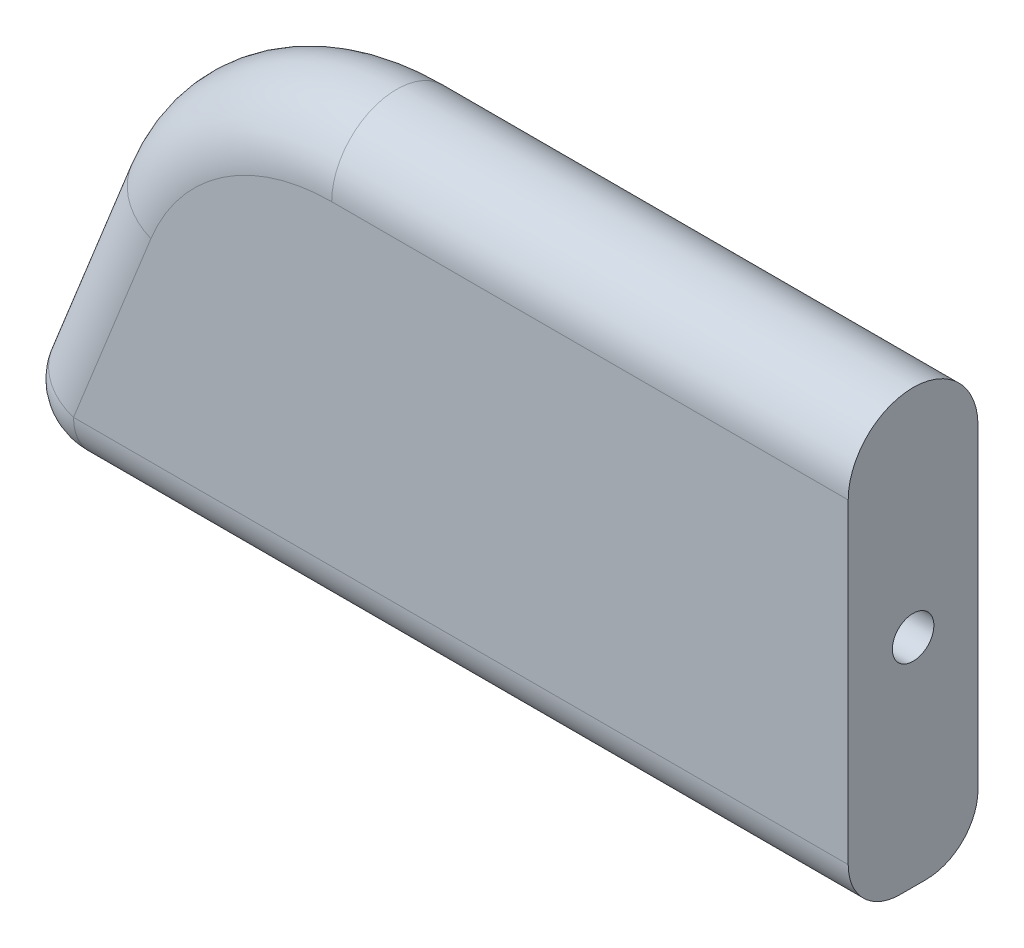
ISO-10303-21;
HEADER;
FILE_DESCRIPTION(('STEP AP214'),'2;1');
FILE_NAME('part.step','',(''),(''),'','','');
FILE_SCHEMA(('AUTOMOTIVE_DESIGN { 1 0 10303 214 1 1 1 1 }'));
ENDSEC;
DATA;
#1=APPLICATION_CONTEXT('core data for automotive mechanical design processes');
#2=APPLICATION_PROTOCOL_DEFINITION('international standard','automotive_design',2000,#1);
#3=PRODUCT_CONTEXT('',#1,'mechanical');
#4=PRODUCT('Part','Part','',(#3));
#5=PRODUCT_RELATED_PRODUCT_CATEGORY('part','',(#4));
#6=PRODUCT_DEFINITION_FORMATION('','',#4);
#7=PRODUCT_DEFINITION_CONTEXT('part definition',#1,'design');
#8=PRODUCT_DEFINITION('design','',#6,#7);
#9=PRODUCT_DEFINITION_SHAPE('','',#8);
#10=(LENGTH_UNIT() NAMED_UNIT(*) SI_UNIT(.MILLI.,.METRE.));
#11=(NAMED_UNIT(*) PLANE_ANGLE_UNIT() SI_UNIT($,.RADIAN.));
#12=(NAMED_UNIT(*) SI_UNIT($,.STERADIAN.) SOLID_ANGLE_UNIT());
#13=UNCERTAINTY_MEASURE_WITH_UNIT(LENGTH_MEASURE(1.E-05),#10,'distance_accuracy_value','');
#14=(GEOMETRIC_REPRESENTATION_CONTEXT(3) GLOBAL_UNCERTAINTY_ASSIGNED_CONTEXT((#13)) GLOBAL_UNIT_ASSIGNED_CONTEXT((#10,
#11,#12)) REPRESENTATION_CONTEXT('',''));
#15=CARTESIAN_POINT('',(0.,0.,0.));
#16=DIRECTION('',(0.,0.,1.));
#17=DIRECTION('',(1.,0.,0.));
#18=AXIS2_PLACEMENT_3D('',#15,#16,#17);
#19=CARTESIAN_POINT('',(-59.689011157193,-5.,0.));
#20=DIRECTION('',(0.,0.,1.));
#21=DIRECTION('',(1.,0.,0.));
#22=AXIS2_PLACEMENT_3D('',#19,#20,#21);
#23=TOROIDAL_SURFACE('',#22,22.5,7.5);
#24=CARTESIAN_POINT('',(-80.5797367021113,3.35629021796731,0.));
#25=DIRECTION('',(-0.371390676354103,-0.928476690885259,0.));
#26=DIRECTION('',(0.,0.,1.));
#27=AXIS2_PLACEMENT_3D('',#24,#25,#26);
#28=CIRCLE('',#27,7.5);
#29=CARTESIAN_POINT('',(-80.5797367021113,3.35629021796731,7.5));
#30=VERTEX_POINT('',#29);
#31=CARTESIAN_POINT('',(-80.5797367021113,3.35629021796731,-7.5));
#32=VERTEX_POINT('',#31);
#33=EDGE_CURVE('E173',#30,#32,#28,.T.);
#34=ORIENTED_EDGE('',*,*,#33,.F.);
#35=CARTESIAN_POINT('',(-59.689011157193,-5.,7.5));
#36=DIRECTION('',(0.,0.,-1.));
#37=DIRECTION('',(-1.,0.,0.));
#38=AXIS2_PLACEMENT_3D('',#35,#36,#37);
#39=CIRCLE('',#38,22.5);
#40=CARTESIAN_POINT('',(-59.689011157193,17.5,7.5));
#41=VERTEX_POINT('',#40);
#42=EDGE_CURVE('E126',#41,#30,#39,.F.);
#43=ORIENTED_EDGE('',*,*,#42,.F.);
#44=CARTESIAN_POINT('',(-59.689011157193,17.5,7.5));
#45=CARTESIAN_POINT('',(-59.689011157193,17.6227185869567,7.50000260316581));
#46=CARTESIAN_POINT('',(-59.689011157193,17.7454369524094,7.49698812843865));
#47=CARTESIAN_POINT('',(-59.689011157193,17.9905781625018,7.48494371463894));
#48=CARTESIAN_POINT('',(-59.689011157193,18.1130010071414,7.4759137755664));
#49=CARTESIAN_POINT('',(-59.689011157193,18.357256097802,7.45185712451655));
#50=CARTESIAN_POINT('',(-59.689011157193,18.479088343823,7.43683041253923));
#51=CARTESIAN_POINT('',(-59.689011157193,18.7218687730074,7.40081723693248));
#52=CARTESIAN_POINT('',(-59.689011157193,18.8428169561708,7.37983077330304));
#53=CARTESIAN_POINT('',(-59.689011157193,19.0835378740711,7.33194843274541));
#54=CARTESIAN_POINT('',(-59.689011157193,19.203310608808,7.30505255581723));
#55=CARTESIAN_POINT('',(-59.689011157193,19.4413920897409,7.24541624210093));
#56=CARTESIAN_POINT('',(-59.689011157193,19.5597008359369,7.21267580531283));
#57=CARTESIAN_POINT('',(-59.689011157193,19.7945693228801,7.1414292306703));
#58=CARTESIAN_POINT('',(-59.689011157193,19.9111290636273,7.10292309281587));
#59=CARTESIAN_POINT('',(-59.689011157193,20.142218737256,7.02023788492944));
#60=CARTESIAN_POINT('',(-59.689011157193,20.2567486701374,6.97605881489746));
#61=CARTESIAN_POINT('',(-59.689011157193,20.4835028153389,6.88213417277185));
#62=CARTESIAN_POINT('',(-59.689011157193,20.5957270276589,6.83238860067823));
#63=CARTESIAN_POINT('',(-59.689011157193,20.8175993737953,6.72745079617342));
#64=CARTESIAN_POINT('',(-59.689011157193,20.9272475076117,6.67225856376224));
#65=CARTESIAN_POINT('',(-59.689011157193,21.1437035447783,6.55656040146308));
#66=CARTESIAN_POINT('',(-59.689011157193,21.2505114481286,6.49605447157511));
#67=CARTESIAN_POINT('',(-59.689011157193,21.4610297147697,6.36987467842897));
#68=CARTESIAN_POINT('',(-59.689011157193,21.5647400780606,6.3042008151708));
#69=CARTESIAN_POINT('',(-59.689011157193,21.7688134172334,6.16784336936737));
#70=CARTESIAN_POINT('',(-59.689011157193,21.8691763931154,6.09715978682211));
#71=CARTESIAN_POINT('',(-59.689011157193,22.066313174271,5.95095318538756));
#72=CARTESIAN_POINT('',(-59.689011157193,22.1630869795446,5.87543016649827));
#73=CARTESIAN_POINT('',(-59.689011157193,22.3528122829101,5.71972663394278));
#74=CARTESIAN_POINT('',(-59.689011157193,22.4457637810019,5.63954612027658));
#75=CARTESIAN_POINT('',(-59.689011157193,22.6276205417034,5.4747207600478));
#76=CARTESIAN_POINT('',(-59.689011157193,22.716525804313,5.39007591348521));
#77=CARTESIAN_POINT('',(-59.689011157193,22.8900759134852,5.216525804313));
#78=CARTESIAN_POINT('',(-59.689011157193,22.9747207600478,5.12762054170337));
#79=CARTESIAN_POINT('',(-59.689011157193,23.1395461202766,4.9457637810019));
#80=CARTESIAN_POINT('',(-59.689011157193,23.2197266339428,4.85281228291005));
#81=CARTESIAN_POINT('',(-59.689011157193,23.3754301664983,4.66308697954463));
#82=CARTESIAN_POINT('',(-59.689011157193,23.4509531853877,4.56631317427105));
#83=CARTESIAN_POINT('',(-59.689011157193,23.597159786822,4.36917639311545));
#84=CARTESIAN_POINT('',(-59.689011157193,23.667843369367,4.26881341723343));
#85=CARTESIAN_POINT('',(-59.689011157193,23.8042008151712,4.0647400780606));
#86=CARTESIAN_POINT('',(-59.689011157193,23.8698746784303,3.9610297147698));
#87=CARTESIAN_POINT('',(-59.689011157193,23.9960544715738,3.75051144812853));
#88=CARTESIAN_POINT('',(-59.689011157193,24.0565604014581,3.64370354477806));
#89=CARTESIAN_POINT('',(-59.689011157193,24.1722585637672,3.4272475076119));
#90=CARTESIAN_POINT('',(-59.689011157193,24.227450796192,3.31759937379621));
#91=CARTESIAN_POINT('',(-59.689011157193,24.3323886006597,3.09572702765802));
#92=CARTESIAN_POINT('',(-59.689011157193,24.3821341727027,2.98350281533551));
#93=CARTESIAN_POINT('',(-59.689011157193,24.4760588149666,2.75674867014084));
#94=CARTESIAN_POINT('',(-59.689011157193,24.5202378851876,2.64221873726868));
#95=CARTESIAN_POINT('',(-59.689011157193,24.6029230925577,2.41112906361462));
#96=CARTESIAN_POINT('',(-59.689011157193,24.6414292297069,2.29456932283273));
#97=CARTESIAN_POINT('',(-59.689011157193,24.7126758062763,2.0597008359842));
#98=CARTESIAN_POINT('',(-59.689011157193,24.7454162456965,1.94139208991755));
#99=CARTESIAN_POINT('',(-59.689011157193,24.8050525522217,1.7033106086314));
#100=CARTESIAN_POINT('',(-59.689011157193,24.8319484193267,1.5835378734119));
#101=CARTESIAN_POINT('',(-59.689011157193,24.8798307867218,1.34281695683002));
#102=CARTESIAN_POINT('',(-59.689011157193,24.9008172870119,1.22186877546766));
#103=CARTESIAN_POINT('',(-59.689011157193,24.9368303624598,0.979088341362769));
#104=CARTESIAN_POINT('',(-59.689011157193,24.9518569376176,0.85725608862025));
#105=CARTESIAN_POINT('',(-59.689011157193,24.9759139624653,0.61300101632316));
#106=CARTESIAN_POINT('',(-59.689011157193,24.9849444121551,0.490578196768591));
#107=CARTESIAN_POINT('',(-59.689011157193,24.9969874309225,0.24543691814268));
#108=CARTESIAN_POINT('',(-59.689011157193,25.,0.12271845907134));
#109=CARTESIAN_POINT('',(-59.689011157193,25.,-0.12271845907134));
#110=CARTESIAN_POINT('',(-59.689011157193,24.9969874309225,-0.245436918142681));
#111=CARTESIAN_POINT('',(-59.689011157193,24.9849444121551,-0.490578196768591));
#112=CARTESIAN_POINT('',(-59.689011157193,24.9759139624653,-0.61300101632316));
#113=CARTESIAN_POINT('',(-59.689011157193,24.9518569376176,-0.85725608862025));
#114=CARTESIAN_POINT('',(-59.689011157193,24.9368303624598,-0.979088341362769));
#115=CARTESIAN_POINT('',(-59.689011157193,24.9008172870119,-1.22186877546766));
#116=CARTESIAN_POINT('',(-59.689011157193,24.8798307867218,-1.34281695683002));
#117=CARTESIAN_POINT('',(-59.689011157193,24.8319484193267,-1.5835378734119));
#118=CARTESIAN_POINT('',(-59.689011157193,24.8050525522217,-1.7033106086314));
#119=CARTESIAN_POINT('',(-59.689011157193,24.7454162456965,-1.94139208991755));
#120=CARTESIAN_POINT('',(-59.689011157193,24.7126758062763,-2.0597008359842));
#121=CARTESIAN_POINT('',(-59.689011157193,24.6414292297069,-2.29456932283273));
#122=CARTESIAN_POINT('',(-59.689011157193,24.6029230925577,-2.41112906361462));
#123=CARTESIAN_POINT('',(-59.689011157193,24.5202378851876,-2.64221873726868));
#124=CARTESIAN_POINT('',(-59.689011157193,24.4760588149666,-2.75674867014084));
#125=CARTESIAN_POINT('',(-59.689011157193,24.3821341727027,-2.98350281533551));
#126=CARTESIAN_POINT('',(-59.689011157193,24.3323886006597,-3.09572702765802));
#127=CARTESIAN_POINT('',(-59.689011157193,24.227450796192,-3.31759937379621));
#128=CARTESIAN_POINT('',(-59.689011157193,24.1722585637672,-3.4272475076119));
#129=CARTESIAN_POINT('',(-59.689011157193,24.0565604014581,-3.64370354477806));
#130=CARTESIAN_POINT('',(-59.689011157193,23.9960544715738,-3.75051144812853));
#131=CARTESIAN_POINT('',(-59.689011157193,23.8698746784303,-3.9610297147698));
#132=CARTESIAN_POINT('',(-59.689011157193,23.8042008151712,-4.0647400780606));
#133=CARTESIAN_POINT('',(-59.689011157193,23.667843369367,-4.26881341723343));
#134=CARTESIAN_POINT('',(-59.689011157193,23.597159786822,-4.36917639311545));
#135=CARTESIAN_POINT('',(-59.689011157193,23.4509531853877,-4.56631317427105));
#136=CARTESIAN_POINT('',(-59.689011157193,23.3754301664983,-4.66308697954463));
#137=CARTESIAN_POINT('',(-59.689011157193,23.2197266339428,-4.85281228291005));
#138=CARTESIAN_POINT('',(-59.689011157193,23.1395461202766,-4.9457637810019));
#139=CARTESIAN_POINT('',(-59.689011157193,22.9747207600478,-5.12762054170337));
#140=CARTESIAN_POINT('',(-59.689011157193,22.8900759134852,-5.216525804313));
#141=CARTESIAN_POINT('',(-59.689011157193,22.716525804313,-5.39007591348521));
#142=CARTESIAN_POINT('',(-59.689011157193,22.6276205417034,-5.4747207600478));
#143=CARTESIAN_POINT('',(-59.689011157193,22.4457637810019,-5.63954612027658));
#144=CARTESIAN_POINT('',(-59.689011157193,22.3528122829101,-5.71972663394278));
#145=CARTESIAN_POINT('',(-59.689011157193,22.1630869795446,-5.87543016649827));
#146=CARTESIAN_POINT('',(-59.689011157193,22.066313174271,-5.95095318538756));
#147=CARTESIAN_POINT('',(-59.689011157193,21.8691763931154,-6.09715978682211));
#148=CARTESIAN_POINT('',(-59.689011157193,21.7688134172334,-6.16784336936737));
#149=CARTESIAN_POINT('',(-59.689011157193,21.5647400780606,-6.3042008151708));
#150=CARTESIAN_POINT('',(-59.689011157193,21.4610297147697,-6.36987467842897));
#151=CARTESIAN_POINT('',(-59.689011157193,21.2505114481286,-6.49605447157511));
#152=CARTESIAN_POINT('',(-59.689011157193,21.1437035447783,-6.55656040146308));
#153=CARTESIAN_POINT('',(-59.689011157193,20.9272475076117,-6.67225856376224));
#154=CARTESIAN_POINT('',(-59.689011157193,20.8175993737953,-6.72745079617342));
#155=CARTESIAN_POINT('',(-59.689011157193,20.5957270276589,-6.83238860067823));
#156=CARTESIAN_POINT('',(-59.689011157193,20.4835028153389,-6.88213417277185));
#157=CARTESIAN_POINT('',(-59.689011157193,20.2567486701374,-6.97605881489745));
#158=CARTESIAN_POINT('',(-59.689011157193,20.142218737256,-7.02023788492944));
#159=CARTESIAN_POINT('',(-59.689011157193,19.9111290636273,-7.10292309281587));
#160=CARTESIAN_POINT('',(-59.689011157193,19.7945693228801,-7.1414292306703));
#161=CARTESIAN_POINT('',(-59.689011157193,19.5597008359369,-7.21267580531283));
#162=CARTESIAN_POINT('',(-59.689011157193,19.4413920897409,-7.24541624210093));
#163=CARTESIAN_POINT('',(-59.689011157193,19.203310608808,-7.30505255581723));
#164=CARTESIAN_POINT('',(-59.689011157193,19.0835378740711,-7.33194843274541));
#165=CARTESIAN_POINT('',(-59.689011157193,18.8428169561708,-7.37983077330304));
#166=CARTESIAN_POINT('',(-59.689011157193,18.7218687730074,-7.40081723693248));
#167=CARTESIAN_POINT('',(-59.689011157193,18.479088343823,-7.43683041253923));
#168=CARTESIAN_POINT('',(-59.689011157193,18.357256097802,-7.45185712451655));
#169=CARTESIAN_POINT('',(-59.689011157193,18.1130010071414,-7.4759137755664));
#170=CARTESIAN_POINT('',(-59.689011157193,17.9905781625018,-7.48494371463894));
#171=CARTESIAN_POINT('',(-59.689011157193,17.7454369524094,-7.49698812843865));
#172=CARTESIAN_POINT('',(-59.689011157193,17.6227185869567,-7.50000260316581));
#173=CARTESIAN_POINT('',(-59.689011157193,17.5,-7.5));
#174=B_SPLINE_CURVE_WITH_KNOTS('',3,(#44,#45,#46,#47,#48,#49,#50,#51,#52,#53,#54,#55,#56,#57,
#58,#59,#60,#61,#62,#63,#64,#65,#66,#67,#68,#69,#70,#71,#72,#73,#74,#75,#76,#77,#78,#79,#80,#81,
#82,#83,#84,#85,#86,#87,#88,#89,#90,#91,#92,#93,#94,#95,#96,#97,#98,#99,#100,#101,#102,#103,
#104,#105,#106,#107,#108,#109,#110,#111,#112,#113,#114,#115,#116,#117,#118,#119,#120,#121,#122,
#123,#124,#125,#126,#127,#128,#129,#130,#131,#132,#133,#134,#135,#136,#137,#138,#139,#140,#141,
#142,#143,#144,#145,#146,#147,#148,#149,#150,#151,#152,#153,#154,#155,#156,#157,#158,#159,#160,
#161,#162,#163,#164,#165,#166,#167,#168,#169,#170,#171,#172,#173),.UNSPECIFIED.,.F.,.F.,(4,2,2,
2,2,2,2,2,2,2,2,2,2,2,2,2,2,2,2,2,2,2,2,2,2,2,2,2,2,2,2,2,2,2,2,2,2,2,2,2,2,2,2,2,2,2,2,2,2,2,2,
2,2,2,2,2,2,2,2,2,2,2,2,2,4),(0.,0.368118427843683,0.736236855687369,1.10435528353105,
1.47247371137474,1.84059213921842,2.2087105670621,2.57682899490579,2.94494742274947,
3.31306585059316,3.68118427843684,4.04930270628052,4.41742113412421,4.7855395619679,
5.15365798981158,5.52177641765527,5.88989484549895,6.25801327334263,6.62613170118632,
6.99425012903,7.36236855687369,7.73048698471737,8.09860541256105,8.46672384040474,
8.83484226824842,9.20296069609211,9.57107912393579,9.93919755177948,10.3073159796232,
10.6754344074668,11.0435528353105,11.4116712631542,11.7797896909979,12.1479081188416,
12.5160265466853,12.884144974529,13.2522634023726,13.6203818302163,13.98850025806,
14.3566186859037,14.7247371137474,15.0928555415911,15.4609739694347,15.8290923972784,
16.1972108251221,16.5653292529658,16.9334476808095,17.3015661086532,17.6696845364968,
18.0378029643405,18.4059213921842,18.7740398200279,19.1421582478716,19.5102766757153,
19.878395103559,20.2465135314026,20.6146319592463,20.98275038709,21.3508688149337,
21.7189872427774,22.0871056706211,22.4552240984647,22.8233425263084,23.1914609541521,
23.5595793819958),.UNSPECIFIED.);
#175=CARTESIAN_POINT('',(-59.689011157193,17.5,-7.5));
#176=VERTEX_POINT('',#175);
#177=EDGE_CURVE('E120',#41,#176,#174,.T.);
#178=ORIENTED_EDGE('',*,*,#177,.T.);
#179=CARTESIAN_POINT('',(-59.689011157193,-5.,-7.5));
#180=DIRECTION('',(0.,0.,-1.));
#181=DIRECTION('',(-1.,0.,0.));
#182=AXIS2_PLACEMENT_3D('',#179,#180,#181);
#183=CIRCLE('',#182,22.5);
#184=EDGE_CURVE('E128',#32,#176,#183,.T.);
#185=ORIENTED_EDGE('',*,*,#184,.F.);
#186=EDGE_LOOP('',(#34,#43,#178,#185));
#187=FACE_BOUND('',#186,.T.);
#188=ADVANCED_FACE('F39',(#187),#23,.T.);
#189=CARTESIAN_POINT('',(0.,17.5,0.));
#190=DIRECTION('',(-1.,0.,0.));
#191=DIRECTION('',(0.,-1.,0.));
#192=AXIS2_PLACEMENT_3D('',#189,#190,#191);
#193=CYLINDRICAL_SURFACE('',#192,7.5);
#194=ORIENTED_EDGE('',*,*,#177,.F.);
#195=DIRECTION('',(-1.,0.,0.));
#196=VECTOR('',#195,1.);
#197=CARTESIAN_POINT('',(-59.689011157193,17.5,7.5));
#198=LINE('',#197,#196);
#199=CARTESIAN_POINT('',(0.,17.5,7.5));
#200=VERTEX_POINT('',#199);
#201=EDGE_CURVE('E105',#200,#41,#198,.T.);
#202=ORIENTED_EDGE('',*,*,#201,.F.);
#203=CARTESIAN_POINT('',(0.,17.5,0.));
#204=DIRECTION('',(-1.,0.,0.));
#205=DIRECTION('',(0.,-1.,0.));
#206=AXIS2_PLACEMENT_3D('',#203,#204,#205);
#207=CIRCLE('',#206,7.5);
#208=CARTESIAN_POINT('',(0.,17.5,-7.5));
#209=VERTEX_POINT('',#208);
#210=EDGE_CURVE('E114',#209,#200,#207,.F.);
#211=ORIENTED_EDGE('',*,*,#210,.F.);
#212=DIRECTION('',(1.,0.,0.));
#213=VECTOR('',#212,1.);
#214=CARTESIAN_POINT('',(0.,17.5,-7.5));
#215=LINE('',#214,#213);
#216=EDGE_CURVE('E121',#176,#209,#215,.T.);
#217=ORIENTED_EDGE('',*,*,#216,.F.);
#218=EDGE_LOOP('',(#194,#202,#211,#217));
#219=FACE_BOUND('',#218,.T.);
#220=ADVANCED_FACE('F123',(#219),#193,.T.);
#221=CARTESIAN_POINT('',(-80.5797367021113,3.35629021796731,0.));
#222=DIRECTION('',(-0.371390676354103,-0.928476690885259,0.));
#223=DIRECTION('',(0.928476690885259,-0.371390676354103,0.));
#224=AXIS2_PLACEMENT_3D('',#221,#222,#223);
#225=CYLINDRICAL_SURFACE('',#224,7.5);
#226=DIRECTION('',(0.371390676354103,0.928476690885259,0.));
#227=VECTOR('',#226,1.);
#228=CARTESIAN_POINT('',(-80.5797367021113,3.35629021796731,-7.5));
#229=LINE('',#228,#227);
#230=CARTESIAN_POINT('',(-89.5222527892982,-19.,-7.5));
#231=VERTEX_POINT('',#230);
#232=EDGE_CURVE('E125',#231,#32,#229,.T.);
#233=ORIENTED_EDGE('',*,*,#232,.F.);
#234=CARTESIAN_POINT('',(-89.5222527892982,-19.,0.));
#235=DIRECTION('',(-0.296166320396508,-0.955136383278741,0.));
#236=DIRECTION('',(-0.955136383278741,0.296166320396508,0.));
#237=AXIS2_PLACEMENT_3D('',#234,#235,#236);
#238=ELLIPSE('',#237,7.52396172239067,7.5);
#239=CARTESIAN_POINT('',(-89.5222527892982,-19.,7.5));
#240=VERTEX_POINT('',#239);
#241=EDGE_CURVE('E48',#231,#240,#238,.F.);
#242=ORIENTED_EDGE('',*,*,#241,.T.);
#243=DIRECTION('',(-0.371390676354103,-0.928476690885259,0.));
#244=VECTOR('',#243,1.);
#245=CARTESIAN_POINT('',(-80.5797367021113,3.35629021796733,7.5));
#246=LINE('',#245,#244);
#247=EDGE_CURVE('E130',#30,#240,#246,.T.);
#248=ORIENTED_EDGE('',*,*,#247,.F.);
#249=ORIENTED_EDGE('',*,*,#33,.T.);
#250=EDGE_LOOP('',(#233,#242,#248,#249));
#251=FACE_BOUND('',#250,.T.);
#252=ADVANCED_FACE('F196',(#251),#225,.T.);
#253=CARTESIAN_POINT('',(0.,-25.,7.5));
#254=DIRECTION('',(0.,1.,0.));
#255=DIRECTION('',(-1.,0.,0.));
#256=AXIS2_PLACEMENT_3D('',#253,#254,#255);
#257=PLANE('',#256);
#258=CARTESIAN_POINT('',(-89.5222527892982,-25.,0.));
#259=DIRECTION('',(0.,1.,0.));
#260=DIRECTION('',(-1.,0.,0.));
#261=AXIS2_PLACEMENT_3D('',#258,#259,#260);
#262=ELLIPSE('',#261,1.61554944214035,1.5);
#263=CARTESIAN_POINT('',(-89.5222527892982,-25.,1.5));
#264=VERTEX_POINT('',#263);
#265=CARTESIAN_POINT('',(-89.5222527892982,-25.,-1.5));
#266=VERTEX_POINT('',#265);
#267=EDGE_CURVE('E168',#264,#266,#262,.F.);
#268=ORIENTED_EDGE('',*,*,#267,.T.);
#269=DIRECTION('',(1.,0.,0.));
#270=VECTOR('',#269,1.);
#271=CARTESIAN_POINT('',(0.,-25.,-1.5));
#272=LINE('',#271,#270);
#273=CARTESIAN_POINT('',(0.,-25.,-1.5));
#274=VERTEX_POINT('',#273);
#275=EDGE_CURVE('E166',#266,#274,#272,.T.);
#276=ORIENTED_EDGE('',*,*,#275,.T.);
#277=DIRECTION('',(0.,0.,-1.));
#278=VECTOR('',#277,1.);
#279=CARTESIAN_POINT('',(0.,-25.,7.5));
#280=LINE('',#279,#278);
#281=CARTESIAN_POINT('',(0.,-25.,1.5));
#282=VERTEX_POINT('',#281);
#283=EDGE_CURVE('E110',#282,#274,#280,.T.);
#284=ORIENTED_EDGE('',*,*,#283,.F.);
#285=DIRECTION('',(1.,0.,0.));
#286=VECTOR('',#285,1.);
#287=CARTESIAN_POINT('',(0.,-25.,1.5));
#288=LINE('',#287,#286);
#289=EDGE_CURVE('E164',#282,#264,#288,.F.);
#290=ORIENTED_EDGE('',*,*,#289,.T.);
#291=EDGE_LOOP('',(#268,#276,#284,#290));
#292=FACE_BOUND('',#291,.T.);
#293=ADVANCED_FACE('F238',(#292),#257,.F.);
#294=CARTESIAN_POINT('',(0.,25.,7.5));
#295=DIRECTION('',(-1.,0.,0.));
#296=DIRECTION('',(0.,-1.,0.));
#297=AXIS2_PLACEMENT_3D('',#294,#295,#296);
#298=PLANE('',#297);
#299=CARTESIAN_POINT('',(0.,0.,0.));
#300=DIRECTION('',(1.,0.,0.));
#301=DIRECTION('',(0.,1.,0.));
#302=AXIS2_PLACEMENT_3D('',#299,#300,#301);
#303=CIRCLE('',#302,2.4);
#304=CARTESIAN_POINT('',(0.,2.4,0.));
#305=VERTEX_POINT('',#304);
#306=EDGE_CURVE('E340',#305,#305,#303,.T.);
#307=ORIENTED_EDGE('',*,*,#306,.F.);
#308=EDGE_LOOP('',(#307));
#309=FACE_BOUND('',#308,.T.);
#310=ORIENTED_EDGE('',*,*,#283,.T.);
#311=CARTESIAN_POINT('',(0.,-19.,-1.5));
#312=DIRECTION('',(-1.,0.,0.));
#313=DIRECTION('',(0.,-1.,0.));
#314=AXIS2_PLACEMENT_3D('',#311,#312,#313);
#315=CIRCLE('',#314,6.);
#316=CARTESIAN_POINT('',(0.,-19.,-7.5));
#317=VERTEX_POINT('',#316);
#318=EDGE_CURVE('E142',#274,#317,#315,.F.);
#319=ORIENTED_EDGE('',*,*,#318,.T.);
#320=DIRECTION('',(0.,1.,0.));
#321=VECTOR('',#320,1.);
#322=CARTESIAN_POINT('',(0.,25.,-7.5));
#323=LINE('',#322,#321);
#324=EDGE_CURVE('E111',#317,#209,#323,.T.);
#325=ORIENTED_EDGE('',*,*,#324,.T.);
#326=ORIENTED_EDGE('',*,*,#210,.T.);
#327=DIRECTION('',(0.,1.,0.));
#328=VECTOR('',#327,1.);
#329=CARTESIAN_POINT('',(0.,25.,7.5));
#330=LINE('',#329,#328);
#331=CARTESIAN_POINT('',(0.,-19.,7.5));
#332=VERTEX_POINT('',#331);
#333=EDGE_CURVE('E100',#332,#200,#330,.T.);
#334=ORIENTED_EDGE('',*,*,#333,.F.);
#335=CARTESIAN_POINT('',(0.,-19.,1.5));
#336=DIRECTION('',(-1.,0.,0.));
#337=DIRECTION('',(0.,-1.,0.));
#338=AXIS2_PLACEMENT_3D('',#335,#336,#337);
#339=CIRCLE('',#338,6.);
#340=EDGE_CURVE('E163',#332,#282,#339,.F.);
#341=ORIENTED_EDGE('',*,*,#340,.T.);
#342=EDGE_LOOP('',(#310,#319,#325,#326,#334,#341));
#343=FACE_BOUND('',#342,.T.);
#344=ADVANCED_FACE('F116',(#309,#343),#298,.F.);
#345=CARTESIAN_POINT('',(-59.689011157193,-5.,7.5));
#346=DIRECTION('',(0.,0.,-1.));
#347=DIRECTION('',(-1.,0.,0.));
#348=AXIS2_PLACEMENT_3D('',#345,#346,#347);
#349=PLANE('',#348);
#350=ORIENTED_EDGE('',*,*,#247,.T.);
#351=DIRECTION('',(1.,0.,0.));
#352=VECTOR('',#351,1.);
#353=CARTESIAN_POINT('',(-59.689011157193,-19.,7.5));
#354=LINE('',#353,#352);
#355=EDGE_CURVE('E11',#240,#332,#354,.T.);
#356=ORIENTED_EDGE('',*,*,#355,.T.);
#357=ORIENTED_EDGE('',*,*,#333,.T.);
#358=ORIENTED_EDGE('',*,*,#201,.T.);
#359=ORIENTED_EDGE('',*,*,#42,.T.);
#360=EDGE_LOOP('',(#350,#356,#357,#358,#359));
#361=FACE_BOUND('',#360,.T.);
#362=ADVANCED_FACE('F102',(#361),#349,.F.);
#363=CARTESIAN_POINT('',(-59.689011157193,-5.,-7.5));
#364=DIRECTION('',(0.,0.,-1.));
#365=DIRECTION('',(-1.,0.,0.));
#366=AXIS2_PLACEMENT_3D('',#363,#364,#365);
#367=PLANE('',#366);
#368=ORIENTED_EDGE('',*,*,#324,.F.);
#369=DIRECTION('',(1.,0.,0.));
#370=VECTOR('',#369,1.);
#371=CARTESIAN_POINT('',(-91.9222527892982,-19.,-7.5));
#372=LINE('',#371,#370);
#373=EDGE_CURVE('E63',#317,#231,#372,.F.);
#374=ORIENTED_EDGE('',*,*,#373,.T.);
#375=ORIENTED_EDGE('',*,*,#232,.T.);
#376=ORIENTED_EDGE('',*,*,#184,.T.);
#377=ORIENTED_EDGE('',*,*,#216,.T.);
#378=EDGE_LOOP('',(#368,#374,#375,#376,#377));
#379=FACE_BOUND('',#378,.T.);
#380=ADVANCED_FACE('F231',(#379),#367,.T.);
#381=CARTESIAN_POINT('',(-59.689011157193,-19.,1.5));
#382=DIRECTION('',(1.,0.,0.));
#383=DIRECTION('',(0.,1.,0.));
#384=AXIS2_PLACEMENT_3D('',#381,#382,#383);
#385=CYLINDRICAL_SURFACE('',#384,6.);
#386=ORIENTED_EDGE('',*,*,#340,.F.);
#387=ORIENTED_EDGE('',*,*,#355,.F.);
#388=CARTESIAN_POINT('',(-89.5222527892982,-19.,1.5));
#389=DIRECTION('',(-1.,0.,0.));
#390=DIRECTION('',(0.,0.,1.));
#391=AXIS2_PLACEMENT_3D('',#388,#389,#390);
#392=CIRCLE('',#391,6.);
#393=EDGE_CURVE('E148',#264,#240,#392,.T.);
#394=ORIENTED_EDGE('',*,*,#393,.F.);
#395=ORIENTED_EDGE('',*,*,#289,.F.);
#396=EDGE_LOOP('',(#386,#387,#394,#395));
#397=FACE_BOUND('',#396,.T.);
#398=ADVANCED_FACE('F41',(#397),#385,.T.);
#399=CARTESIAN_POINT('',(-91.1378022314386,-25.,0.));
#400=CARTESIAN_POINT('',(-100.,-25.,0.));
#401=CARTESIAN_POINT('',(-96.7086623767501,-16.7716559418754,0.));
#402=CARTESIAN_POINT('',(-91.1378022314386,-25.,0.0654793461853252));
#403=CARTESIAN_POINT('',(-100.,-25.,0.482134870312191));
#404=CARTESIAN_POINT('',(-96.7086623767501,-16.7716559418754,0.327396730926626));
#405=CARTESIAN_POINT('',(-91.1331734833339,-25.,0.13095869237065));
#406=CARTESIAN_POINT('',(-99.954925590821,-25.,0.963453260006051));
#407=CARTESIAN_POINT('',(-96.6880724282843,-16.7780404220198,0.654793461853252));
#408=CARTESIAN_POINT('',(-91.1147636873255,-25.,0.260794740670949));
#409=CARTESIAN_POINT('',(-99.7774807992032,-25.,1.90699838797034));
#410=CARTESIAN_POINT('',(-96.6061805770746,-16.8034332441004,1.30397370335475));
#411=CARTESIAN_POINT('',(-91.1009579881744,-25.,0.325147938542477));
#412=CARTESIAN_POINT('',(-99.6454604962389,-25.,2.3676800692793));
#413=CARTESIAN_POINT('',(-96.5447690187817,-16.8224755877571,1.62573969271239));
#414=CARTESIAN_POINT('',(-91.0644552238339,-25.,0.451635705261578));
#415=CARTESIAN_POINT('',(-99.302876451284,-25.,3.25145766574088));
#416=CARTESIAN_POINT('',(-96.3823946532674,-16.8728242282266,2.2581785263079));
#417=CARTESIAN_POINT('',(-91.0417125063639,-25.,0.51375706625582));
#418=CARTESIAN_POINT('',(-99.0929451983045,-25.,3.67325271352835));
#419=CARTESIAN_POINT('',(-96.2812287721075,-16.9041934937026,2.56878533127911));
#420=CARTESIAN_POINT('',(-90.9877446092949,-25.,0.634729415455156));
#421=CARTESIAN_POINT('',(-98.6077070929366,-25.,4.46484542361752));
#422=CARTESIAN_POINT('',(-96.0411646782491,-16.9786319724184,3.17364707727578));
#423=CARTESIAN_POINT('',(-90.9564592299336,-25.,0.693553480722436));
#424=CARTESIAN_POINT('',(-98.3332000276562,-25.,4.83369141263312));
#425=CARTESIAN_POINT('',(-95.9019986804002,-17.0217842198134,3.46776740361219));
#426=CARTESIAN_POINT('',(-90.8859536256738,-25.,0.806939328845249));
#427=CARTESIAN_POINT('',(-97.7343922986477,-25.,5.50998818737465));
#428=CARTESIAN_POINT('',(-95.5883703028312,-17.1190333291371,4.03469664422626));
#429=CARTESIAN_POINT('',(-90.8466665098062,-25.,0.861459415875255));
#430=CARTESIAN_POINT('',(-97.4109274258443,-25.,5.81687629257735));
#431=CARTESIAN_POINT('',(-95.4136103736269,-17.1732224544718,4.30729707937629));
#432=CARTESIAN_POINT('',(-90.7608335826002,-25.,0.965319261089835));
#433=CARTESIAN_POINT('',(-96.7302178944238,-25.,6.36485168156922));
#434=CARTESIAN_POINT('',(-95.0318018353657,-17.2916126988938,4.82659630544919));
#435=CARTESIAN_POINT('',(-90.7142219305659,-25.,1.0146044760521));
#436=CARTESIAN_POINT('',(-96.3737272902235,-25.,6.60574525806645));
#437=CARTESIAN_POINT('',(-94.8244603487303,-17.3559046327343,5.07302238026052));
#438=CARTESIAN_POINT('',(-90.6145336451075,-25.,1.10716333557607));
#439=CARTESIAN_POINT('',(-95.6418506127641,-25.,7.02158192411184));
#440=CARTESIAN_POINT('',(-94.3810193547948,-17.4934057161251,5.53581667788034));
#441=CARTESIAN_POINT('',(-90.5613985991898,-25.,1.1503739205358));
#442=CARTESIAN_POINT('',(-95.2670518120979,-25.,7.19663871372841));
#443=CARTESIAN_POINT('',(-94.1446600126088,-17.5666954346324,5.75186960267902));
#444=CARTESIAN_POINT('',(-90.4495628581194,-25.,1.23005122734372));
#445=CARTESIAN_POINT('',(-94.511348241436,-25.,7.48380786125396));
#446=CARTESIAN_POINT('',(-93.6471837850889,-17.7209516292122,6.15025613671862));
#447=CARTESIAN_POINT('',(-90.3908154226826,-25.,1.26645219298767));
#448=CARTESIAN_POINT('',(-94.1308176839851,-25.,7.59626018574379));
#449=CARTESIAN_POINT('',(-93.3858589860767,-17.8019825746424,6.33226096493838));
#450=CARTESIAN_POINT('',(-90.268746634628,-25.,1.33188827588914));
#451=CARTESIAN_POINT('',(-93.3739493167858,-25.,7.76323450409041));
#452=CARTESIAN_POINT('',(-92.8428633426618,-17.9703533167865,6.65944137944571));
#453=CARTESIAN_POINT('',(-90.2053920530653,-25.,1.36086126542233));
#454=CARTESIAN_POINT('',(-92.9977609982563,-25.,7.81824051624013));
#455=CARTESIAN_POINT('',(-92.5610446867449,-18.0577389465282,6.80430632711165));
#456=CARTESIAN_POINT('',(-90.0751783880511,-25.,1.41094007069765));
#457=CARTESIAN_POINT('',(-92.2574170280482,-25.,7.87635569105904));
#458=CARTESIAN_POINT('',(-91.9818183837507,-18.2373440017202,7.05470035348827));
#459=CARTESIAN_POINT('',(-90.0082991471658,-25.,1.43199335678009));
#460=CARTESIAN_POINT('',(-91.8931996579807,-25.,7.8800214197575));
#461=CARTESIAN_POINT('',(-91.6843210708469,-18.3295912305276,7.15996678390048));
#462=CARTESIAN_POINT('',(-89.872166982254,-25.,1.46586109066543));
#463=CARTESIAN_POINT('',(-91.1824684025323,-25.,7.84176901489731));
#464=CARTESIAN_POINT('',(-91.0787676476185,-18.5173597338542,7.32930545332715));
#465=CARTESIAN_POINT('',(-89.8029046326571,-25.,1.47863756870088));
#466=CARTESIAN_POINT('',(-90.8357098873181,-25.,7.8004243266215));
#467=CARTESIAN_POINT('',(-90.7706696097569,-18.6128940091601,7.39318784350443));
#468=CARTESIAN_POINT('',(-89.6631807360345,-25.,1.49571696983838));
#469=CARTESIAN_POINT('',(-90.1638003090628,-25.,7.67825715304866));
#470=CARTESIAN_POINT('',(-90.1491391730561,-18.8056166251914,7.47858484919192));
#471=CARTESIAN_POINT('',(-89.5927167626664,-25.,1.5));
#472=CARTESIAN_POINT('',(-89.8382561101621,-25.,7.59798538518572));
#473=CARTESIAN_POINT('',(-89.8356959811772,-18.9028083125957,7.5));
#474=CARTESIAN_POINT('',(-89.4517888159301,-25.,1.5));
#475=CARTESIAN_POINT('',(-89.2113271649761,-25.,7.40358909210183));
#476=CARTESIAN_POINT('',(-89.2088095974193,-19.0971916874044,7.5));
#477=CARTESIAN_POINT('',(-89.381324842562,-25.,1.49571696983838));
#478=CARTESIAN_POINT('',(-88.9094353396945,-25.,7.28996643898931));
#479=CARTESIAN_POINT('',(-88.8953664055404,-19.1943833748087,7.47858484919192));
#480=CARTESIAN_POINT('',(-89.2416009459393,-25.,1.47863756870088));
#481=CARTESIAN_POINT('',(-88.3313822602353,-25.,7.03389441937517));
#482=CARTESIAN_POINT('',(-88.2738359688395,-19.3871059908399,7.39318784350442));
#483=CARTESIAN_POINT('',(-89.1723385963425,-25.,1.46586109066543));
#484=CARTESIAN_POINT('',(-88.0546314463623,-25.,6.89188179790812));
#485=CARTESIAN_POINT('',(-87.9657379309779,-19.4826402661459,7.32930545332714));
#486=CARTESIAN_POINT('',(-89.0362064314307,-25.,1.43199335678009));
#487=CARTESIAN_POINT('',(-87.5277539490509,-25.,6.58344181384282));
#488=CARTESIAN_POINT('',(-87.3601845077496,-19.6704087694725,7.15996678390047));
#489=CARTESIAN_POINT('',(-88.9693271905453,-25.,1.41094007069765));
#490=CARTESIAN_POINT('',(-87.276982489733,-25.,6.41737602325868));
#491=CARTESIAN_POINT('',(-87.0626871948457,-19.7626559982799,7.05470035348826));
#492=CARTESIAN_POINT('',(-88.8391135255311,-25.,1.36086126542233));
#493=CARTESIAN_POINT('',(-86.8025116213683,-25.,6.06467283970326));
#494=CARTESIAN_POINT('',(-86.4834608918515,-19.9422610534719,6.80430632711164));
#495=CARTESIAN_POINT('',(-88.7757589439684,-25.,1.33188827588914));
#496=CARTESIAN_POINT('',(-86.5781356935152,-25.,5.87831513185885));
#497=CARTESIAN_POINT('',(-86.2016422359347,-20.0296466832135,6.65944137944568));
#498=CARTESIAN_POINT('',(-88.6536901559139,-25.,1.26645219298767));
#499=CARTESIAN_POINT('',(-86.1566257327739,-25.,5.4883774375696));
#500=CARTESIAN_POINT('',(-85.6586465925198,-20.1980174253577,6.33226096493836));
#501=CARTESIAN_POINT('',(-88.5949427204771,-25.,1.23005122734372));
#502=CARTESIAN_POINT('',(-85.9588044183022,-25.,5.28498997259924));
#503=CARTESIAN_POINT('',(-85.3973217935076,-20.2790483707878,6.15025613671861));
#504=CARTESIAN_POINT('',(-88.4831069794067,-25.,1.1503739205358));
#505=CARTESIAN_POINT('',(-85.5904100408448,-25.,4.86393296626336));
#506=CARTESIAN_POINT('',(-84.8998455659876,-20.4333045653676,5.751869602679));
#507=CARTESIAN_POINT('',(-88.4299719334889,-25.,1.10716333557607));
#508=CARTESIAN_POINT('',(-85.4191590761841,-25.,4.64636417387187));
#509=CARTESIAN_POINT('',(-84.6634862238017,-20.5065942838749,5.53581667788032));
#510=CARTESIAN_POINT('',(-88.3302836480306,-25.,1.0146044760521));
#511=CARTESIAN_POINT('',(-85.1038219835855,-25.,4.19955775006042));
#512=CARTESIAN_POINT('',(-84.2200452298661,-20.6440953672658,5.0730223802605));
#513=CARTESIAN_POINT('',(-88.2836719959962,-25.,0.965319261089835));
#514=CARTESIAN_POINT('',(-84.9590881717092,-25.,3.97032549574661));
#515=CARTESIAN_POINT('',(-84.0127037432307,-20.7083873011062,4.82659630544917));
#516=CARTESIAN_POINT('',(-88.1978390687902,-25.,0.861459415875255));
#517=CARTESIAN_POINT('',(-84.6966561819092,-25.,3.50255134249562));
#518=CARTESIAN_POINT('',(-83.6308952049695,-20.8267775455283,4.30729707937627));
#519=CARTESIAN_POINT('',(-88.1585519529226,-25.,0.806939328845249));
#520=CARTESIAN_POINT('',(-84.5783630294232,-25.,3.26391815592029));
#521=CARTESIAN_POINT('',(-83.4561352757653,-20.8809666708629,4.03469664422624));
#522=CARTESIAN_POINT('',(-88.0880463486629,-25.,0.693553480722436));
#523=CARTESIAN_POINT('',(-84.3686611993825,-25.,2.77950798893663));
#524=CARTESIAN_POINT('',(-83.1425068981963,-20.9782157801867,3.46776740361217));
#525=CARTESIAN_POINT('',(-88.0567609693015,-25.,0.634729415455156));
#526=CARTESIAN_POINT('',(-84.2767343904972,-25.,2.53354597565264));
#527=CARTESIAN_POINT('',(-83.0033409003474,-21.0213680275817,3.17364707727576));
#528=CARTESIAN_POINT('',(-88.0027930722326,-25.,0.513757066255821));
#529=CARTESIAN_POINT('',(-84.1196037739763,-25.,2.03649870388819));
#530=CARTESIAN_POINT('',(-82.763276806489,-21.0958065062975,2.56878533127909));
#531=CARTESIAN_POINT('',(-87.9800503547625,-25.,0.451635705261578));
#532=CARTESIAN_POINT('',(-84.0539832288443,-25.,1.78514374099067));
#533=CARTESIAN_POINT('',(-82.6621109253291,-21.1271757717734,2.25817852630788));
#534=CARTESIAN_POINT('',(-87.9435475904221,-25.,0.325147938542477));
#535=CARTESIAN_POINT('',(-83.9492991805773,-25.,1.27922266586875));
#536=CARTESIAN_POINT('',(-82.4997365598147,-21.177524412243,1.62573969271238));
#537=CARTESIAN_POINT('',(-87.929741891271,-25.,0.260794740670949));
#538=CARTESIAN_POINT('',(-83.9099429209077,-25.,1.02431864342375));
#539=CARTESIAN_POINT('',(-82.4383250015219,-21.1965667558997,1.30397370335474));
#540=CARTESIAN_POINT('',(-87.9113320952626,-25.,0.130958692370651));
#541=CARTESIAN_POINT('',(-83.8576217246018,-25.,0.513131709618342));
#542=CARTESIAN_POINT('',(-82.3564331503121,-21.2219595779802,0.654793461853251));
#543=CARTESIAN_POINT('',(-87.9067033471579,-25.,0.0654793461853254));
#544=CARTESIAN_POINT('',(-83.8445055785965,-25.,0.256466376201));
#545=CARTESIAN_POINT('',(-82.3358432018463,-21.2283440581246,0.327396730926626));
#546=CARTESIAN_POINT('',(-87.9067033471579,-25.,-0.065479346185325));
#547=CARTESIAN_POINT('',(-83.8445055785965,-25.,-0.256466376200999));
#548=CARTESIAN_POINT('',(-82.3358432018463,-21.2283440581246,-0.327396730926624));
#549=CARTESIAN_POINT('',(-87.9113320952626,-25.,-0.13095869237065));
#550=CARTESIAN_POINT('',(-83.8576217246018,-25.,-0.513131709618341));
#551=CARTESIAN_POINT('',(-82.3564331503121,-21.2219595779802,-0.654793461853249));
#552=CARTESIAN_POINT('',(-87.929741891271,-25.,-0.260794740670949));
#553=CARTESIAN_POINT('',(-83.9099429209077,-25.,-1.02431864342375));
#554=CARTESIAN_POINT('',(-82.4383250015219,-21.1965667558997,-1.30397370335474));
#555=CARTESIAN_POINT('',(-87.9435475904221,-25.,-0.325147938542477));
#556=CARTESIAN_POINT('',(-83.9492991805773,-25.,-1.27922266586875));
#557=CARTESIAN_POINT('',(-82.4997365598147,-21.177524412243,-1.62573969271238));
#558=CARTESIAN_POINT('',(-87.9800503547625,-25.,-0.451635705261578));
#559=CARTESIAN_POINT('',(-84.0539832288443,-25.,-1.78514374099067));
#560=CARTESIAN_POINT('',(-82.6621109253291,-21.1271757717734,-2.25817852630788));
#561=CARTESIAN_POINT('',(-88.0027930722326,-25.,-0.51375706625582));
#562=CARTESIAN_POINT('',(-84.1196037739763,-25.,-2.03649870388819));
#563=CARTESIAN_POINT('',(-82.763276806489,-21.0958065062975,-2.56878533127909));
#564=CARTESIAN_POINT('',(-88.0567609693015,-25.,-0.634729415455155));
#565=CARTESIAN_POINT('',(-84.2767343904972,-25.,-2.53354597565264));
#566=CARTESIAN_POINT('',(-83.0033409003474,-21.0213680275817,-3.17364707727576));
#567=CARTESIAN_POINT('',(-88.0880463486629,-25.,-0.693553480722436));
#568=CARTESIAN_POINT('',(-84.3686611993825,-25.,-2.77950798893663));
#569=CARTESIAN_POINT('',(-83.1425068981963,-20.9782157801867,-3.46776740361217));
#570=CARTESIAN_POINT('',(-88.1585519529226,-25.,-0.806939328845249));
#571=CARTESIAN_POINT('',(-84.5783630294232,-25.,-3.26391815592029));
#572=CARTESIAN_POINT('',(-83.4561352757653,-20.8809666708629,-4.03469664422624));
#573=CARTESIAN_POINT('',(-88.1978390687902,-25.,-0.861459415875255));
#574=CARTESIAN_POINT('',(-84.6966561819092,-25.,-3.50255134249562));
#575=CARTESIAN_POINT('',(-83.6308952049695,-20.8267775455283,-4.30729707937627));
#576=CARTESIAN_POINT('',(-88.2836719959962,-25.,-0.965319261089835));
#577=CARTESIAN_POINT('',(-84.9590881717092,-25.,-3.9703254957466));
#578=CARTESIAN_POINT('',(-84.0127037432307,-20.7083873011062,-4.82659630544917));
#579=CARTESIAN_POINT('',(-88.3302836480306,-25.,-1.0146044760521));
#580=CARTESIAN_POINT('',(-85.1038219835855,-25.,-4.19955775006042));
#581=CARTESIAN_POINT('',(-84.2200452298661,-20.6440953672658,-5.07302238026049));
#582=CARTESIAN_POINT('',(-88.4299719334889,-25.,-1.10716333557607));
#583=CARTESIAN_POINT('',(-85.4191590761841,-25.,-4.64636417387187));
#584=CARTESIAN_POINT('',(-84.6634862238017,-20.5065942838749,-5.53581667788032));
#585=CARTESIAN_POINT('',(-88.4831069794067,-25.,-1.1503739205358));
#586=CARTESIAN_POINT('',(-85.5904100408448,-25.,-4.86393296626336));
#587=CARTESIAN_POINT('',(-84.8998455659876,-20.4333045653676,-5.751869602679));
#588=CARTESIAN_POINT('',(-88.5949427204771,-25.,-1.23005122734372));
#589=CARTESIAN_POINT('',(-85.9588044183022,-25.,-5.28498997259924));
#590=CARTESIAN_POINT('',(-85.3973217935076,-20.2790483707878,-6.15025613671861));
#591=CARTESIAN_POINT('',(-88.6536901559139,-25.,-1.26645219298767));
#592=CARTESIAN_POINT('',(-86.1566257327739,-25.,-5.48837743756959));
#593=CARTESIAN_POINT('',(-85.6586465925197,-20.1980174253577,-6.33226096493836));
#594=CARTESIAN_POINT('',(-88.7757589439684,-25.,-1.33188827588914));
#595=CARTESIAN_POINT('',(-86.5781356935152,-25.,-5.87831513185884));
#596=CARTESIAN_POINT('',(-86.2016422359347,-20.0296466832135,-6.65944137944568));
#597=CARTESIAN_POINT('',(-88.8391135255311,-25.,-1.36086126542233));
#598=CARTESIAN_POINT('',(-86.8025116213683,-25.,-6.06467283970326));
#599=CARTESIAN_POINT('',(-86.4834608918515,-19.9422610534719,-6.80430632711164));
#600=CARTESIAN_POINT('',(-88.9693271905453,-25.,-1.41094007069765));
#601=CARTESIAN_POINT('',(-87.276982489733,-25.,-6.41737602325868));
#602=CARTESIAN_POINT('',(-87.0626871948457,-19.7626559982799,-7.05470035348826));
#603=CARTESIAN_POINT('',(-89.0362064314307,-25.,-1.43199335678009));
#604=CARTESIAN_POINT('',(-87.5277539490509,-25.,-6.58344181384282));
#605=CARTESIAN_POINT('',(-87.3601845077496,-19.6704087694725,-7.15996678390047));
#606=CARTESIAN_POINT('',(-89.1723385963425,-25.,-1.46586109066543));
#607=CARTESIAN_POINT('',(-88.0546314463623,-25.,-6.89188179790812));
#608=CARTESIAN_POINT('',(-87.9657379309779,-19.4826402661459,-7.32930545332714));
#609=CARTESIAN_POINT('',(-89.2416009459393,-25.,-1.47863756870088));
#610=CARTESIAN_POINT('',(-88.3313822602353,-25.,-7.03389441937517));
#611=CARTESIAN_POINT('',(-88.2738359688395,-19.3871059908399,-7.39318784350442));
#612=CARTESIAN_POINT('',(-89.381324842562,-25.,-1.49571696983838));
#613=CARTESIAN_POINT('',(-88.9094353396945,-25.,-7.28996643898931));
#614=CARTESIAN_POINT('',(-88.8953664055404,-19.1943833748087,-7.47858484919192));
#615=CARTESIAN_POINT('',(-89.4517888159301,-25.,-1.5));
#616=CARTESIAN_POINT('',(-89.2113271649761,-25.,-7.40358909210183));
#617=CARTESIAN_POINT('',(-89.2088095974193,-19.0971916874044,-7.5));
#618=CARTESIAN_POINT('',(-89.5927167626664,-25.,-1.5));
#619=CARTESIAN_POINT('',(-89.8382561101621,-25.,-7.59798538518572));
#620=CARTESIAN_POINT('',(-89.8356959811772,-18.9028083125957,-7.5));
#621=CARTESIAN_POINT('',(-89.6631807360345,-25.,-1.49571696983838));
#622=CARTESIAN_POINT('',(-90.1638003090628,-25.,-7.67825715304866));
#623=CARTESIAN_POINT('',(-90.1491391730561,-18.8056166251914,-7.47858484919192));
#624=CARTESIAN_POINT('',(-89.8029046326572,-25.,-1.47863756870088));
#625=CARTESIAN_POINT('',(-90.8357098873181,-25.,-7.8004243266215));
#626=CARTESIAN_POINT('',(-90.7706696097569,-18.6128940091601,-7.39318784350443));
#627=CARTESIAN_POINT('',(-89.872166982254,-25.,-1.46586109066543));
#628=CARTESIAN_POINT('',(-91.1824684025323,-25.,-7.84176901489731));
#629=CARTESIAN_POINT('',(-91.0787676476185,-18.5173597338542,-7.32930545332715));
#630=CARTESIAN_POINT('',(-90.0082991471658,-25.,-1.43199335678009));
#631=CARTESIAN_POINT('',(-91.8931996579807,-25.,-7.8800214197575));
#632=CARTESIAN_POINT('',(-91.6843210708469,-18.3295912305276,-7.15996678390048));
#633=CARTESIAN_POINT('',(-90.0751783880511,-25.,-1.41094007069765));
#634=CARTESIAN_POINT('',(-92.2574170280482,-25.,-7.87635569105904));
#635=CARTESIAN_POINT('',(-91.9818183837507,-18.2373440017202,-7.05470035348827));
#636=CARTESIAN_POINT('',(-90.2053920530653,-25.,-1.36086126542233));
#637=CARTESIAN_POINT('',(-92.9977609982563,-25.,-7.81824051624013));
#638=CARTESIAN_POINT('',(-92.5610446867449,-18.0577389465282,-6.80430632711165));
#639=CARTESIAN_POINT('',(-90.268746634628,-25.,-1.33188827588914));
#640=CARTESIAN_POINT('',(-93.3739493167858,-25.,-7.76323450409041));
#641=CARTESIAN_POINT('',(-92.8428633426618,-17.9703533167865,-6.65944137944571));
#642=CARTESIAN_POINT('',(-90.3908154226826,-25.,-1.26645219298767));
#643=CARTESIAN_POINT('',(-94.1308176839851,-25.,-7.59626018574379));
#644=CARTESIAN_POINT('',(-93.3858589860767,-17.8019825746424,-6.33226096493838));
#645=CARTESIAN_POINT('',(-90.4495628581194,-25.,-1.23005122734372));
#646=CARTESIAN_POINT('',(-94.511348241436,-25.,-7.48380786125396));
#647=CARTESIAN_POINT('',(-93.6471837850889,-17.7209516292122,-6.15025613671862));
#648=CARTESIAN_POINT('',(-90.5613985991898,-25.,-1.1503739205358));
#649=CARTESIAN_POINT('',(-95.2670518120979,-25.,-7.19663871372841));
#650=CARTESIAN_POINT('',(-94.1446600126088,-17.5666954346324,-5.75186960267902));
#651=CARTESIAN_POINT('',(-90.6145336451075,-25.,-1.10716333557607));
#652=CARTESIAN_POINT('',(-95.6418506127641,-25.,-7.02158192411184));
#653=CARTESIAN_POINT('',(-94.3810193547948,-17.4934057161251,-5.53581667788034));
#654=CARTESIAN_POINT('',(-90.7142219305659,-25.,-1.0146044760521));
#655=CARTESIAN_POINT('',(-96.3737272902235,-25.,-6.60574525806645));
#656=CARTESIAN_POINT('',(-94.8244603487303,-17.3559046327343,-5.07302238026052));
#657=CARTESIAN_POINT('',(-90.7608335826002,-25.,-0.965319261089835));
#658=CARTESIAN_POINT('',(-96.7302178944238,-25.,-6.36485168156922));
#659=CARTESIAN_POINT('',(-95.0318018353657,-17.2916126988938,-4.82659630544919));
#660=CARTESIAN_POINT('',(-90.8466665098062,-25.,-0.861459415875255));
#661=CARTESIAN_POINT('',(-97.4109274258443,-25.,-5.81687629257736));
#662=CARTESIAN_POINT('',(-95.4136103736269,-17.1732224544718,-4.30729707937629));
#663=CARTESIAN_POINT('',(-90.8859536256738,-25.,-0.80693932884525));
#664=CARTESIAN_POINT('',(-97.7343922986477,-25.,-5.50998818737465));
#665=CARTESIAN_POINT('',(-95.5883703028312,-17.1190333291371,-4.03469664422626));
#666=CARTESIAN_POINT('',(-90.9564592299336,-25.,-0.693553480722436));
#667=CARTESIAN_POINT('',(-98.3332000276563,-25.,-4.83369141263312));
#668=CARTESIAN_POINT('',(-95.9019986804002,-17.0217842198134,-3.46776740361219));
#669=CARTESIAN_POINT('',(-90.9877446092949,-25.,-0.634729415455156));
#670=CARTESIAN_POINT('',(-98.6077070929366,-25.,-4.46484542361752));
#671=CARTESIAN_POINT('',(-96.0411646782491,-16.9786319724184,-3.17364707727578));
#672=CARTESIAN_POINT('',(-91.0417125063639,-25.,-0.513757066255821));
#673=CARTESIAN_POINT('',(-99.0929451983045,-25.,-3.67325271352836));
#674=CARTESIAN_POINT('',(-96.2812287721075,-16.9041934937026,-2.56878533127911));
#675=CARTESIAN_POINT('',(-91.0644552238339,-25.,-0.451635705261579));
#676=CARTESIAN_POINT('',(-99.302876451284,-25.,-3.25145766574089));
#677=CARTESIAN_POINT('',(-96.3823946532674,-16.8728242282266,-2.2581785263079));
#678=CARTESIAN_POINT('',(-91.1009579881744,-25.,-0.325147938542477));
#679=CARTESIAN_POINT('',(-99.6454604962389,-25.,-2.36768006927931));
#680=CARTESIAN_POINT('',(-96.5447690187817,-16.8224755877571,-1.62573969271239));
#681=CARTESIAN_POINT('',(-91.1147636873255,-25.,-0.260794740670949));
#682=CARTESIAN_POINT('',(-99.7774807992031,-25.,-1.90699838797034));
#683=CARTESIAN_POINT('',(-96.6061805770746,-16.8034332441004,-1.30397370335475));
#684=CARTESIAN_POINT('',(-91.1331734833339,-25.,-0.13095869237065));
#685=CARTESIAN_POINT('',(-99.954925590821,-25.,-0.963453260006053));
#686=CARTESIAN_POINT('',(-96.6880724282843,-16.7780404220198,-0.654793461853253));
#687=CARTESIAN_POINT('',(-91.1378022314386,-25.,-0.0654793461853252));
#688=CARTESIAN_POINT('',(-100.,-25.,-0.482134870312191));
#689=CARTESIAN_POINT('',(-96.7086623767501,-16.7716559418754,-0.327396730926626));
#690=CARTESIAN_POINT('',(-91.1378022314386,-25.,0.));
#691=CARTESIAN_POINT('',(-100.,-25.,0.));
#692=CARTESIAN_POINT('',(-96.7086623767501,-16.7716559418754,0.));
#693=(BOUNDED_SURFACE() B_SPLINE_SURFACE(3,2,((#399,#400,#401),(#402,#403,#404),(#405,#406,
#407),(#408,#409,#410),(#411,#412,#413),(#414,#415,#416),(#417,#418,#419),(#420,#421,#422),
(#423,#424,#425),(#426,#427,#428),(#429,#430,#431),(#432,#433,#434),(#435,#436,#437),(#438,#439,
#440),(#441,#442,#443),(#444,#445,#446),(#447,#448,#449),(#450,#451,#452),(#453,#454,#455),
(#456,#457,#458),(#459,#460,#461),(#462,#463,#464),(#465,#466,#467),(#468,#469,#470),(#471,#472,
#473),(#474,#475,#476),(#477,#478,#479),(#480,#481,#482),(#483,#484,#485),(#486,#487,#488),
(#489,#490,#491),(#492,#493,#494),(#495,#496,#497),(#498,#499,#500),(#501,#502,#503),(#504,#505,
#506),(#507,#508,#509),(#510,#511,#512),(#513,#514,#515),(#516,#517,#518),(#519,#520,#521),
(#522,#523,#524),(#525,#526,#527),(#528,#529,#530),(#531,#532,#533),(#534,#535,#536),(#537,#538,
#539),(#540,#541,#542),(#543,#544,#545),(#546,#547,#548),(#549,#550,#551),(#552,#553,#554),
(#555,#556,#557),(#558,#559,#560),(#561,#562,#563),(#564,#565,#566),(#567,#568,#569),(#570,#571,
#572),(#573,#574,#575),(#576,#577,#578),(#579,#580,#581),(#582,#583,#584),(#585,#586,#587),
(#588,#589,#590),(#591,#592,#593),(#594,#595,#596),(#597,#598,#599),(#600,#601,#602),(#603,#604,
#605),(#606,#607,#608),(#609,#610,#611),(#612,#613,#614),(#615,#616,#617),(#618,#619,#620),
(#621,#622,#623),(#624,#625,#626),(#627,#628,#629),(#630,#631,#632),(#633,#634,#635),(#636,#637,
#638),(#639,#640,#641),(#642,#643,#644),(#645,#646,#647),(#648,#649,#650),(#651,#652,#653),
(#654,#655,#656),(#657,#658,#659),(#660,#661,#662),(#663,#664,#665),(#666,#667,#668),(#669,#670,
#671),(#672,#673,#674),(#675,#676,#677),(#678,#679,#680),(#681,#682,#683),(#684,#685,#686),
(#687,#688,#689),(#690,#691,#692)),.UNSPECIFIED.,.T.,.F.,.F.) B_SPLINE_SURFACE_WITH_KNOTS((4,2,
2,2,2,2,2,2,2,2,2,2,2,2,2,2,2,2,2,2,2,2,2,2,2,2,2,2,2,2,2,2,2,2,2,2,2,2,2,2,2,2,2,2,2,2,2,2,4),
(3,3),(0.,0.196276520146302,0.39308242308737,0.590907003241643,0.790163320315207,
0.991159256070891,1.19407789159389,1.39896804461264,1.60574469043189,1.81419820456117,
2.0240109375717,2.23477949313469,2.44604112023678,2.65730274733887,2.86807130290186,
3.07788403591239,3.28633755004167,3.49311419586092,3.69800434887967,3.90092298440267,
4.10191892015835,4.30117523723192,4.49899981738619,4.69580572032726,4.89208224047356,
5.08835876061986,5.28516466356093,5.4829892437152,5.68224556078877,5.88324149654445,
6.08616013206745,6.2910502850862,6.49782693090545,6.70628044503473,6.91609317804526,
7.12686173360825,7.33812336071034,7.54938498781243,7.76015354337542,7.96996627638595,
8.17841979051523,8.38519643633448,8.59008658935323,8.79300522487623,8.99400116063191,
9.19325747770548,9.39108205785975,9.58788796080082,9.78416448094712),(0.,1.),
.UNSPECIFIED.) GEOMETRIC_REPRESENTATION_ITEM() RATIONAL_B_SPLINE_SURFACE(((1.,0.560628809305185,
1.),(1.,0.560628809305185,1.),(1.,0.561103915442531,1.),(1.,0.562986358627833,1.),(1.,
0.564396206565231,1.),(1.,0.568101020403245,1.),(1.,0.570400529946847,1.),(1.,0.575812471286347,
1.),(1.,0.578930666082674,1.),(1.,0.585888171822594,1.),(1.,0.589733540834982,1.),(1.,
0.598039947654912,1.),(1.,0.602506522992975,1.),(1.,0.611941936153751,1.),(1.,0.616915232229291,
1.),(1.,0.627247610588993,1.),(1.,0.632609823325505,1.),(1.,0.64360436347129,1.),(1.,
0.6492385287466,1.),(1.,0.660664963697233,1.),(1.,0.666458024744026,1.),(1.,0.678095864663172,
1.),(1.,0.68394075891501,1.),(1.,0.69558274793789,1.),(1.,0.701379698899082,1.),(1.,
0.712833863474015,1.),(1.,0.718491077087755,1.),(1.,0.729581743732768,1.),(1.,0.735015688191014,
1.),(1.,0.745583798425368,1.),(1.,0.750719211926806,1.),(1.,0.760622193212222,1.),(1.,
0.765391928470452,1.),(1.,0.774503312332425,1.),(1.,0.778848095950055,1.),(1.,0.787057017376768,
1.),(1.,0.790925178639835,1.),(1.,0.798135846897592,1.),(1.,0.801483053754047,1.),(1.,
0.807614252737241,1.),(1.,0.810403280938505,1.),(1.,0.815387934273472,1.),(1.,0.817588486384245,
1.),(1.,0.82137330563352,1.),(1.,0.822961887413313,1.),(1.,0.825507108545092,1.),(1.,
0.826466959895957,1.),(1.,0.827746162899232,1.),(1.,0.828067230469273,1.),(1.,0.828067230469273,
1.),(1.,0.827746162899232,1.),(1.,0.826466959895957,1.),(1.,0.825507108545092,1.),(1.,
0.822961887413313,1.),(1.,0.82137330563352,1.),(1.,0.817588486384245,1.),(1.,0.815387934273472,
1.),(1.,0.810403280938505,1.),(1.,0.807614252737241,1.),(1.,0.801483053754047,1.),(1.,
0.798135846897592,1.),(1.,0.790925178639835,1.),(1.,0.787057017376768,1.),(1.,0.778848095950055,
1.),(1.,0.774503312332425,1.),(1.,0.765391928470452,1.),(1.,0.760622193212222,1.),(1.,
0.750719211926806,1.),(1.,0.745583798425368,1.),(1.,0.735015688191014,1.),(1.,0.729581743732768,
1.),(1.,0.718491077087755,1.),(1.,0.712833863474015,1.),(1.,0.701379698899082,1.),(1.,
0.69558274793789,1.),(1.,0.68394075891501,1.),(1.,0.678095864663172,1.),(1.,0.666458024744026,
1.),(1.,0.660664963697233,1.),(1.,0.6492385287466,1.),(1.,0.64360436347129,1.),(1.,
0.632609823325505,1.),(1.,0.627247610588993,1.),(1.,0.616915232229291,1.),(1.,0.611941936153751,
1.),(1.,0.602506522992975,1.),(1.,0.598039947654912,1.),(1.,0.589733540834982,1.),(1.,
0.585888171822594,1.),(1.,0.578930666082674,1.),(1.,0.575812471286347,1.),(1.,0.570400529946847,
1.),(1.,0.568101020403245,1.),(1.,0.564396206565231,1.),(1.,0.562986358627833,1.),(1.,
0.561103915442531,1.),(1.,0.560628809305185,1.),(1.,0.560628809305185,1.))) REPRESENTATION_ITEM('') SURFACE());
#694=ORIENTED_EDGE('',*,*,#393,.T.);
#695=ORIENTED_EDGE('',*,*,#241,.F.);
#696=CARTESIAN_POINT('',(-89.5222527892982,-19.,-1.5));
#697=DIRECTION('',(1.,0.,0.));
#698=DIRECTION('',(0.,0.,-1.));
#699=AXIS2_PLACEMENT_3D('',#696,#697,#698);
#700=CIRCLE('',#699,6.);
#701=EDGE_CURVE('E146',#266,#231,#700,.T.);
#702=ORIENTED_EDGE('',*,*,#701,.F.);
#703=ORIENTED_EDGE('',*,*,#267,.F.);
#704=EDGE_LOOP('',(#694,#695,#702,#703));
#705=FACE_BOUND('',#704,.T.);
#706=ADVANCED_FACE('F236',(#705),#693,.T.);
#707=CARTESIAN_POINT('',(0.,-19.,-1.5));
#708=DIRECTION('',(-1.,0.,0.));
#709=DIRECTION('',(0.,-1.,0.));
#710=AXIS2_PLACEMENT_3D('',#707,#708,#709);
#711=CYLINDRICAL_SURFACE('',#710,6.);
#712=ORIENTED_EDGE('',*,*,#701,.T.);
#713=ORIENTED_EDGE('',*,*,#373,.F.);
#714=ORIENTED_EDGE('',*,*,#318,.F.);
#715=ORIENTED_EDGE('',*,*,#275,.F.);
#716=EDGE_LOOP('',(#712,#713,#714,#715));
#717=FACE_BOUND('',#716,.T.);
#718=ADVANCED_FACE('F233',(#717),#711,.T.);
#719=CARTESIAN_POINT('',(-3.5,0.,0.));
#720=DIRECTION('',(1.,0.,0.));
#721=DIRECTION('',(0.,1.,0.));
#722=AXIS2_PLACEMENT_3D('',#719,#720,#721);
#723=CYLINDRICAL_SURFACE('',#722,2.4);
#724=CARTESIAN_POINT('',(-3.5,0.,0.));
#725=DIRECTION('',(1.,0.,0.));
#726=DIRECTION('',(0.,1.,0.));
#727=AXIS2_PLACEMENT_3D('',#724,#725,#726);
#728=CIRCLE('',#727,2.4);
#729=CARTESIAN_POINT('',(-3.5,2.4,0.));
#730=VERTEX_POINT('',#729);
#731=EDGE_CURVE('E149',#730,#730,#728,.T.);
#732=ORIENTED_EDGE('',*,*,#731,.F.);
#733=EDGE_LOOP('',(#732));
#734=FACE_BOUND('',#733,.T.);
#735=ORIENTED_EDGE('',*,*,#306,.T.);
#736=EDGE_LOOP('',(#735));
#737=FACE_BOUND('',#736,.T.);
#738=ADVANCED_FACE('F250',(#734,#737),#723,.F.);
#739=CARTESIAN_POINT('',(-3.5,0.,0.));
#740=DIRECTION('',(1.,0.,0.));
#741=DIRECTION('',(0.,1.,0.));
#742=AXIS2_PLACEMENT_3D('',#739,#740,#741);
#743=PLANE('',#742);
#744=ORIENTED_EDGE('',*,*,#731,.T.);
#745=EDGE_LOOP('',(#744));
#746=FACE_BOUND('',#745,.T.);
#747=ADVANCED_FACE('F254',(#746),#743,.T.);
#748=CLOSED_SHELL('',(#188,#220,#252,#293,#344,#362,#380,#398,#706,#718,#738,#747));
#749=MANIFOLD_SOLID_BREP('B2',#748);
#750=ADVANCED_BREP_SHAPE_REPRESENTATION('',(#18,#749),#14);
#751=SHAPE_DEFINITION_REPRESENTATION(#9,#750);
ENDSEC;
END-ISO-10303-21;
